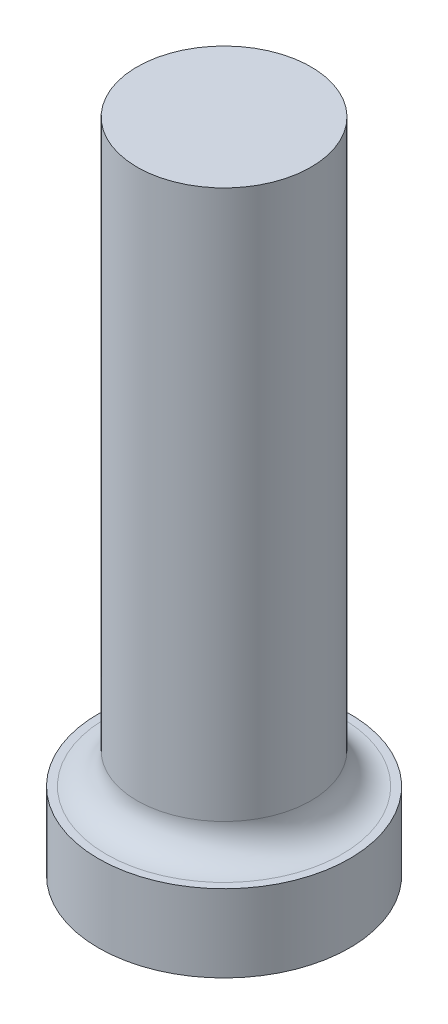
ISO-10303-21;
HEADER;
FILE_DESCRIPTION(('STEP AP214'),'2;1');
FILE_NAME('part.step','',(''),(''),'','','');
FILE_SCHEMA(('AUTOMOTIVE_DESIGN { 1 0 10303 214 1 1 1 1 }'));
ENDSEC;
DATA;
#1=APPLICATION_CONTEXT('core data for automotive mechanical design processes');
#2=APPLICATION_PROTOCOL_DEFINITION('international standard','automotive_design',2000,#1);
#3=PRODUCT_CONTEXT('',#1,'mechanical');
#4=PRODUCT('Part','Part','',(#3));
#5=PRODUCT_RELATED_PRODUCT_CATEGORY('part','',(#4));
#6=PRODUCT_DEFINITION_FORMATION('','',#4);
#7=PRODUCT_DEFINITION_CONTEXT('part definition',#1,'design');
#8=PRODUCT_DEFINITION('design','',#6,#7);
#9=PRODUCT_DEFINITION_SHAPE('','',#8);
#10=(LENGTH_UNIT() NAMED_UNIT(*) SI_UNIT(.MILLI.,.METRE.));
#11=(NAMED_UNIT(*) PLANE_ANGLE_UNIT() SI_UNIT($,.RADIAN.));
#12=(NAMED_UNIT(*) SI_UNIT($,.STERADIAN.) SOLID_ANGLE_UNIT());
#13=UNCERTAINTY_MEASURE_WITH_UNIT(LENGTH_MEASURE(1.E-05),#10,'distance_accuracy_value','');
#14=(GEOMETRIC_REPRESENTATION_CONTEXT(3) GLOBAL_UNCERTAINTY_ASSIGNED_CONTEXT((#13)) GLOBAL_UNIT_ASSIGNED_CONTEXT((#10,
#11,#12)) REPRESENTATION_CONTEXT('',''));
#15=CARTESIAN_POINT('',(0.,0.,0.));
#16=DIRECTION('',(0.,0.,1.));
#17=DIRECTION('',(1.,0.,0.));
#18=AXIS2_PLACEMENT_3D('',#15,#16,#17);
#19=CARTESIAN_POINT('',(0.,15.,0.));
#20=DIRECTION('',(0.,-1.,0.));
#21=DIRECTION('',(0.,0.,-1.));
#22=AXIS2_PLACEMENT_3D('',#19,#20,#21);
#23=CYLINDRICAL_SURFACE('',#22,2.25);
#24=CARTESIAN_POINT('',(0.,0.8,0.));
#25=DIRECTION('',(0.,1.,0.));
#26=DIRECTION('',(0.,0.,1.));
#27=AXIS2_PLACEMENT_3D('',#24,#25,#26);
#28=CIRCLE('',#27,2.25);
#29=CARTESIAN_POINT('',(0.,0.8,2.25));
#30=VERTEX_POINT('',#29);
#31=EDGE_CURVE('E50',#30,#30,#28,.T.);
#32=ORIENTED_EDGE('',*,*,#31,.T.);
#33=EDGE_LOOP('',(#32));
#34=FACE_BOUND('',#33,.T.);
#35=CARTESIAN_POINT('',(0.,15.,0.));
#36=DIRECTION('',(0.,1.,0.));
#37=DIRECTION('',(0.,0.,1.));
#38=AXIS2_PLACEMENT_3D('',#35,#36,#37);
#39=CIRCLE('',#38,2.25);
#40=CARTESIAN_POINT('',(0.,15.,2.25));
#41=VERTEX_POINT('',#40);
#42=EDGE_CURVE('E55',#41,#41,#39,.T.);
#43=ORIENTED_EDGE('',*,*,#42,.F.);
#44=EDGE_LOOP('',(#43));
#45=FACE_BOUND('',#44,.T.);
#46=ADVANCED_FACE('F42',(#34,#45),#23,.T.);
#47=CARTESIAN_POINT('',(0.,15.,0.));
#48=DIRECTION('',(0.,1.,0.));
#49=DIRECTION('',(0.,0.,1.));
#50=AXIS2_PLACEMENT_3D('',#47,#48,#49);
#51=PLANE('',#50);
#52=ORIENTED_EDGE('',*,*,#42,.T.);
#53=EDGE_LOOP('',(#52));
#54=FACE_BOUND('',#53,.T.);
#55=ADVANCED_FACE('F83',(#54),#51,.T.);
#56=CARTESIAN_POINT('',(0.,-2.,0.));
#57=DIRECTION('',(0.,1.,0.));
#58=DIRECTION('',(0.,0.,1.));
#59=AXIS2_PLACEMENT_3D('',#56,#57,#58);
#60=CYLINDRICAL_SURFACE('',#59,3.25);
#61=CARTESIAN_POINT('',(0.,-2.,0.));
#62=DIRECTION('',(0.,1.,0.));
#63=DIRECTION('',(0.,0.,1.));
#64=AXIS2_PLACEMENT_3D('',#61,#62,#63);
#65=CIRCLE('',#64,3.25);
#66=CARTESIAN_POINT('',(0.,-2.,3.25));
#67=VERTEX_POINT('',#66);
#68=EDGE_CURVE('E60',#67,#67,#65,.T.);
#69=ORIENTED_EDGE('',*,*,#68,.T.);
#70=EDGE_LOOP('',(#69));
#71=FACE_BOUND('',#70,.T.);
#72=CARTESIAN_POINT('',(0.,0.,0.));
#73=DIRECTION('',(0.,1.,0.));
#74=DIRECTION('',(0.,0.,1.));
#75=AXIS2_PLACEMENT_3D('',#72,#73,#74);
#76=CIRCLE('',#75,3.25);
#77=CARTESIAN_POINT('',(0.,0.,3.25));
#78=VERTEX_POINT('',#77);
#79=EDGE_CURVE('E63',#78,#78,#76,.T.);
#80=ORIENTED_EDGE('',*,*,#79,.F.);
#81=EDGE_LOOP('',(#80));
#82=FACE_BOUND('',#81,.T.);
#83=ADVANCED_FACE('F71',(#71,#82),#60,.T.);
#84=CARTESIAN_POINT('',(0.,-2.,0.));
#85=DIRECTION('',(0.,1.,0.));
#86=DIRECTION('',(0.,0.,1.));
#87=AXIS2_PLACEMENT_3D('',#84,#85,#86);
#88=PLANE('',#87);
#89=ORIENTED_EDGE('',*,*,#68,.F.);
#90=EDGE_LOOP('',(#89));
#91=FACE_BOUND('',#90,.T.);
#92=ADVANCED_FACE('F74',(#91),#88,.F.);
#93=CARTESIAN_POINT('',(0.,0.,0.));
#94=DIRECTION('',(0.,1.,0.));
#95=DIRECTION('',(0.,0.,1.));
#96=AXIS2_PLACEMENT_3D('',#93,#94,#95);
#97=PLANE('',#96);
#98=CARTESIAN_POINT('',(0.,0.,0.));
#99=DIRECTION('',(0.,1.,0.));
#100=DIRECTION('',(0.,0.,1.));
#101=AXIS2_PLACEMENT_3D('',#98,#99,#100);
#102=CIRCLE('',#101,3.05);
#103=CARTESIAN_POINT('',(0.,0.,3.05));
#104=VERTEX_POINT('',#103);
#105=EDGE_CURVE('E10',#104,#104,#102,.F.);
#106=ORIENTED_EDGE('',*,*,#105,.T.);
#107=EDGE_LOOP('',(#106));
#108=FACE_BOUND('',#107,.T.);
#109=ORIENTED_EDGE('',*,*,#79,.T.);
#110=EDGE_LOOP('',(#109));
#111=FACE_BOUND('',#110,.T.);
#112=ADVANCED_FACE('F76',(#108,#111),#97,.T.);
#113=CARTESIAN_POINT('',(0.,0.8,0.));
#114=DIRECTION('',(0.,1.,0.));
#115=DIRECTION('',(0.,0.,1.));
#116=AXIS2_PLACEMENT_3D('',#113,#114,#115);
#117=TOROIDAL_SURFACE('',#116,3.05,0.8);
#118=ORIENTED_EDGE('',*,*,#105,.F.);
#119=EDGE_LOOP('',(#118));
#120=FACE_BOUND('',#119,.T.);
#121=ORIENTED_EDGE('',*,*,#31,.F.);
#122=EDGE_LOOP('',(#121));
#123=FACE_BOUND('',#122,.T.);
#124=ADVANCED_FACE('F44',(#120,#123),#117,.F.);
#125=CLOSED_SHELL('',(#46,#55,#83,#92,#112,#124));
#126=MANIFOLD_SOLID_BREP('B2',#125);
#127=ADVANCED_BREP_SHAPE_REPRESENTATION('',(#18,#126),#14);
#128=SHAPE_DEFINITION_REPRESENTATION(#9,#127);
ENDSEC;
END-ISO-10303-21;
